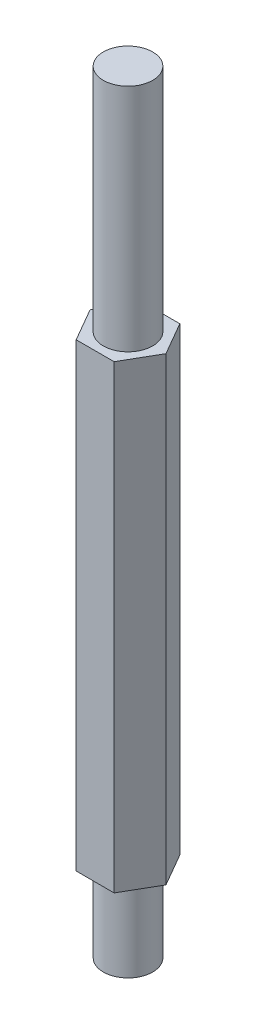
ISO-10303-21;
HEADER;
FILE_DESCRIPTION(('STEP AP214'),'2;1');
FILE_NAME('part.step','',(''),(''),'','','');
FILE_SCHEMA(('AUTOMOTIVE_DESIGN { 1 0 10303 214 1 1 1 1 }'));
ENDSEC;
DATA;
#1=APPLICATION_CONTEXT('core data for automotive mechanical design processes');
#2=APPLICATION_PROTOCOL_DEFINITION('international standard','automotive_design',2000,#1);
#3=PRODUCT_CONTEXT('',#1,'mechanical');
#4=PRODUCT('Part','Part','',(#3));
#5=PRODUCT_RELATED_PRODUCT_CATEGORY('part','',(#4));
#6=PRODUCT_DEFINITION_FORMATION('','',#4);
#7=PRODUCT_DEFINITION_CONTEXT('part definition',#1,'design');
#8=PRODUCT_DEFINITION('design','',#6,#7);
#9=PRODUCT_DEFINITION_SHAPE('','',#8);
#10=(LENGTH_UNIT() NAMED_UNIT(*) SI_UNIT(.MILLI.,.METRE.));
#11=(NAMED_UNIT(*) PLANE_ANGLE_UNIT() SI_UNIT($,.RADIAN.));
#12=(NAMED_UNIT(*) SI_UNIT($,.STERADIAN.) SOLID_ANGLE_UNIT());
#13=UNCERTAINTY_MEASURE_WITH_UNIT(LENGTH_MEASURE(1.E-05),#10,'distance_accuracy_value','');
#14=(GEOMETRIC_REPRESENTATION_CONTEXT(3) GLOBAL_UNCERTAINTY_ASSIGNED_CONTEXT((#13)) GLOBAL_UNIT_ASSIGNED_CONTEXT((#10,
#11,#12)) REPRESENTATION_CONTEXT('',''));
#15=CARTESIAN_POINT('',(0.,0.,0.));
#16=DIRECTION('',(0.,0.,1.));
#17=DIRECTION('',(1.,0.,0.));
#18=AXIS2_PLACEMENT_3D('',#15,#16,#17);
#19=CARTESIAN_POINT('',(-13.929382152786,28.,-4.46581124048437));
#20=DIRECTION('',(-0.866025403784439,0.,-0.5));
#21=DIRECTION('',(-0.5,0.,0.866025403784439));
#22=AXIS2_PLACEMENT_3D('',#19,#20,#21);
#23=PLANE('',#22);
#24=DIRECTION('',(0.5,0.,-0.866025403784439));
#25=VECTOR('',#24,1.);
#26=CARTESIAN_POINT('',(-13.929382152786,0.,-4.46581124048437));
#27=LINE('',#26,#25);
#28=CARTESIAN_POINT('',(-13.929382152786,0.,-4.46581124048437));
#29=VERTEX_POINT('',#28);
#30=CARTESIAN_POINT('',(-12.7746816144068,0.,-6.46581124048437));
#31=VERTEX_POINT('',#30);
#32=EDGE_CURVE('E131',#29,#31,#27,.T.);
#33=ORIENTED_EDGE('',*,*,#32,.T.);
#34=DIRECTION('',(0.,-1.,0.));
#35=VECTOR('',#34,1.);
#36=CARTESIAN_POINT('',(-12.7746816144068,28.,-6.46581124048437));
#37=LINE('',#36,#35);
#38=CARTESIAN_POINT('',(-12.7746816144068,28.,-6.46581124048437));
#39=VERTEX_POINT('',#38);
#40=EDGE_CURVE('E42',#39,#31,#37,.T.);
#41=ORIENTED_EDGE('',*,*,#40,.F.);
#42=DIRECTION('',(0.5,0.,-0.866025403784439));
#43=VECTOR('',#42,1.);
#44=CARTESIAN_POINT('',(-13.929382152786,28.,-4.46581124048437));
#45=LINE('',#44,#43);
#46=CARTESIAN_POINT('',(-13.929382152786,28.,-4.46581124048437));
#47=VERTEX_POINT('',#46);
#48=EDGE_CURVE('E148',#47,#39,#45,.T.);
#49=ORIENTED_EDGE('',*,*,#48,.F.);
#50=DIRECTION('',(0.,-1.,0.));
#51=VECTOR('',#50,1.);
#52=CARTESIAN_POINT('',(-13.929382152786,28.,-4.46581124048437));
#53=LINE('',#52,#51);
#54=EDGE_CURVE('E127',#47,#29,#53,.T.);
#55=ORIENTED_EDGE('',*,*,#54,.T.);
#56=EDGE_LOOP('',(#33,#41,#49,#55));
#57=FACE_BOUND('',#56,.T.);
#58=ADVANCED_FACE('F39',(#57),#23,.F.);
#59=CARTESIAN_POINT('',(-12.7746816144068,28.,-6.46581124048437));
#60=DIRECTION('',(-0.866025403784439,0.,0.5));
#61=DIRECTION('',(0.5,0.,0.866025403784439));
#62=AXIS2_PLACEMENT_3D('',#59,#60,#61);
#63=PLANE('',#62);
#64=DIRECTION('',(-0.5,0.,-0.866025403784439));
#65=VECTOR('',#64,1.);
#66=CARTESIAN_POINT('',(-12.7746816144068,0.,-6.46581124048437));
#67=LINE('',#66,#65);
#68=CARTESIAN_POINT('',(-13.9293821527861,0.,-8.46581124048438));
#69=VERTEX_POINT('',#68);
#70=EDGE_CURVE('E135',#31,#69,#67,.T.);
#71=ORIENTED_EDGE('',*,*,#70,.T.);
#72=DIRECTION('',(0.,-1.,0.));
#73=VECTOR('',#72,1.);
#74=CARTESIAN_POINT('',(-13.9293821527861,28.,-8.46581124048438));
#75=LINE('',#74,#73);
#76=CARTESIAN_POINT('',(-13.9293821527861,28.,-8.46581124048438));
#77=VERTEX_POINT('',#76);
#78=EDGE_CURVE('E154',#77,#69,#75,.T.);
#79=ORIENTED_EDGE('',*,*,#78,.F.);
#80=DIRECTION('',(-0.5,0.,-0.866025403784439));
#81=VECTOR('',#80,1.);
#82=CARTESIAN_POINT('',(-12.7746816144068,28.,-6.46581124048437));
#83=LINE('',#82,#81);
#84=EDGE_CURVE('E96',#39,#77,#83,.T.);
#85=ORIENTED_EDGE('',*,*,#84,.F.);
#86=ORIENTED_EDGE('',*,*,#40,.T.);
#87=EDGE_LOOP('',(#71,#79,#85,#86));
#88=FACE_BOUND('',#87,.T.);
#89=ADVANCED_FACE('F208',(#88),#63,.F.);
#90=CARTESIAN_POINT('',(-13.9293821527861,28.,-8.46581124048438));
#91=DIRECTION('',(0.,0.,1.));
#92=DIRECTION('',(1.,0.,0.));
#93=AXIS2_PLACEMENT_3D('',#90,#91,#92);
#94=PLANE('',#93);
#95=DIRECTION('',(-1.,0.,0.));
#96=VECTOR('',#95,1.);
#97=CARTESIAN_POINT('',(-13.9293821527861,0.,-8.46581124048438));
#98=LINE('',#97,#96);
#99=CARTESIAN_POINT('',(-16.2387832295446,0.,-8.46581124048438));
#100=VERTEX_POINT('',#99);
#101=EDGE_CURVE('E139',#69,#100,#98,.T.);
#102=ORIENTED_EDGE('',*,*,#101,.T.);
#103=DIRECTION('',(0.,-1.,0.));
#104=VECTOR('',#103,1.);
#105=CARTESIAN_POINT('',(-16.2387832295446,28.,-8.46581124048438));
#106=LINE('',#105,#104);
#107=CARTESIAN_POINT('',(-16.2387832295446,28.,-8.46581124048438));
#108=VERTEX_POINT('',#107);
#109=EDGE_CURVE('E120',#108,#100,#106,.T.);
#110=ORIENTED_EDGE('',*,*,#109,.F.);
#111=DIRECTION('',(-1.,0.,0.));
#112=VECTOR('',#111,1.);
#113=CARTESIAN_POINT('',(-13.9293821527861,28.,-8.46581124048438));
#114=LINE('',#113,#112);
#115=EDGE_CURVE('E109',#77,#108,#114,.T.);
#116=ORIENTED_EDGE('',*,*,#115,.F.);
#117=ORIENTED_EDGE('',*,*,#78,.T.);
#118=EDGE_LOOP('',(#102,#110,#116,#117));
#119=FACE_BOUND('',#118,.T.);
#120=ADVANCED_FACE('F212',(#119),#94,.F.);
#121=CARTESIAN_POINT('',(-16.2387832295446,28.,-8.46581124048438));
#122=DIRECTION('',(0.866025403784439,0.,0.499999999999999));
#123=DIRECTION('',(0.499999999999999,0.,-0.866025403784439));
#124=AXIS2_PLACEMENT_3D('',#121,#122,#123);
#125=PLANE('',#124);
#126=DIRECTION('',(-0.499999999999999,0.,0.866025403784439));
#127=VECTOR('',#126,1.);
#128=CARTESIAN_POINT('',(-16.2387832295446,0.,-8.46581124048438));
#129=LINE('',#128,#127);
#130=CARTESIAN_POINT('',(-17.3934837679238,0.,-6.46581124048437));
#131=VERTEX_POINT('',#130);
#132=EDGE_CURVE('E118',#100,#131,#129,.T.);
#133=ORIENTED_EDGE('',*,*,#132,.T.);
#134=DIRECTION('',(0.,-1.,0.));
#135=VECTOR('',#134,1.);
#136=CARTESIAN_POINT('',(-17.3934837679238,28.,-6.46581124048437));
#137=LINE('',#136,#135);
#138=CARTESIAN_POINT('',(-17.3934837679238,28.,-6.46581124048437));
#139=VERTEX_POINT('',#138);
#140=EDGE_CURVE('E115',#139,#131,#137,.T.);
#141=ORIENTED_EDGE('',*,*,#140,.F.);
#142=DIRECTION('',(-0.499999999999999,0.,0.866025403784439));
#143=VECTOR('',#142,1.);
#144=CARTESIAN_POINT('',(-16.2387832295446,28.,-8.46581124048438));
#145=LINE('',#144,#143);
#146=EDGE_CURVE('E103',#108,#139,#145,.T.);
#147=ORIENTED_EDGE('',*,*,#146,.F.);
#148=ORIENTED_EDGE('',*,*,#109,.T.);
#149=EDGE_LOOP('',(#133,#141,#147,#148));
#150=FACE_BOUND('',#149,.T.);
#151=ADVANCED_FACE('F116',(#150),#125,.F.);
#152=CARTESIAN_POINT('',(-17.3934837679238,28.,-6.46581124048437));
#153=DIRECTION('',(0.866025403784439,0.,-0.5));
#154=DIRECTION('',(-0.5,0.,-0.866025403784439));
#155=AXIS2_PLACEMENT_3D('',#152,#153,#154);
#156=PLANE('',#155);
#157=DIRECTION('',(0.5,0.,0.866025403784439));
#158=VECTOR('',#157,1.);
#159=CARTESIAN_POINT('',(-17.3934837679238,0.,-6.46581124048437));
#160=LINE('',#159,#158);
#161=CARTESIAN_POINT('',(-16.2387832295445,0.,-4.46581124048437));
#162=VERTEX_POINT('',#161);
#163=EDGE_CURVE('E81',#131,#162,#160,.T.);
#164=ORIENTED_EDGE('',*,*,#163,.T.);
#165=DIRECTION('',(0.,-1.,0.));
#166=VECTOR('',#165,1.);
#167=CARTESIAN_POINT('',(-16.2387832295445,28.,-4.46581124048437));
#168=LINE('',#167,#166);
#169=CARTESIAN_POINT('',(-16.2387832295445,28.,-4.46581124048437));
#170=VERTEX_POINT('',#169);
#171=EDGE_CURVE('E121',#170,#162,#168,.T.);
#172=ORIENTED_EDGE('',*,*,#171,.F.);
#173=DIRECTION('',(0.5,0.,0.866025403784439));
#174=VECTOR('',#173,1.);
#175=CARTESIAN_POINT('',(-17.3934837679238,28.,-6.46581124048437));
#176=LINE('',#175,#174);
#177=EDGE_CURVE('E107',#139,#170,#176,.T.);
#178=ORIENTED_EDGE('',*,*,#177,.F.);
#179=ORIENTED_EDGE('',*,*,#140,.T.);
#180=EDGE_LOOP('',(#164,#172,#178,#179));
#181=FACE_BOUND('',#180,.T.);
#182=ADVANCED_FACE('F123',(#181),#156,.F.);
#183=CARTESIAN_POINT('',(-16.2387832295445,28.,-4.46581124048437));
#184=DIRECTION('',(0.,0.,-1.));
#185=DIRECTION('',(-1.,0.,0.));
#186=AXIS2_PLACEMENT_3D('',#183,#184,#185);
#187=PLANE('',#186);
#188=DIRECTION('',(1.,0.,0.));
#189=VECTOR('',#188,1.);
#190=CARTESIAN_POINT('',(-16.2387832295445,0.,-4.46581124048437));
#191=LINE('',#190,#189);
#192=EDGE_CURVE('E87',#162,#29,#191,.T.);
#193=ORIENTED_EDGE('',*,*,#192,.T.);
#194=ORIENTED_EDGE('',*,*,#54,.F.);
#195=DIRECTION('',(1.,0.,0.));
#196=VECTOR('',#195,1.);
#197=CARTESIAN_POINT('',(-16.2387832295445,28.,-4.46581124048437));
#198=LINE('',#197,#196);
#199=EDGE_CURVE('E58',#170,#47,#198,.T.);
#200=ORIENTED_EDGE('',*,*,#199,.F.);
#201=ORIENTED_EDGE('',*,*,#171,.T.);
#202=EDGE_LOOP('',(#193,#194,#200,#201));
#203=FACE_BOUND('',#202,.T.);
#204=ADVANCED_FACE('F197',(#203),#187,.F.);
#205=CARTESIAN_POINT('',(0.,28.,0.));
#206=DIRECTION('',(0.,1.,0.));
#207=DIRECTION('',(0.,0.,1.));
#208=AXIS2_PLACEMENT_3D('',#205,#206,#207);
#209=PLANE('',#208);
#210=CARTESIAN_POINT('',(-15.0834837679238,28.,-6.46581124048438));
#211=DIRECTION('',(0.,1.,0.));
#212=DIRECTION('',(0.,0.,1.));
#213=AXIS2_PLACEMENT_3D('',#210,#211,#212);
#214=CIRCLE('',#213,1.5);
#215=CARTESIAN_POINT('',(-15.0834837679238,28.,-4.96581124048438));
#216=VERTEX_POINT('',#215);
#217=EDGE_CURVE('E49',#216,#216,#214,.T.);
#218=ORIENTED_EDGE('',*,*,#217,.F.);
#219=EDGE_LOOP('',(#218));
#220=FACE_BOUND('',#219,.T.);
#221=ORIENTED_EDGE('',*,*,#48,.T.);
#222=ORIENTED_EDGE('',*,*,#84,.T.);
#223=ORIENTED_EDGE('',*,*,#115,.T.);
#224=ORIENTED_EDGE('',*,*,#146,.T.);
#225=ORIENTED_EDGE('',*,*,#177,.T.);
#226=ORIENTED_EDGE('',*,*,#199,.T.);
#227=EDGE_LOOP('',(#221,#222,#223,#224,#225,#226));
#228=FACE_BOUND('',#227,.T.);
#229=ADVANCED_FACE('F105',(#220,#228),#209,.T.);
#230=CARTESIAN_POINT('',(0.,0.,0.));
#231=DIRECTION('',(0.,1.,0.));
#232=DIRECTION('',(0.,0.,1.));
#233=AXIS2_PLACEMENT_3D('',#230,#231,#232);
#234=PLANE('',#233);
#235=CARTESIAN_POINT('',(-15.0834837679238,0.,-6.46581124048438));
#236=DIRECTION('',(0.,-1.,0.));
#237=DIRECTION('',(0.,0.,-1.));
#238=AXIS2_PLACEMENT_3D('',#235,#236,#237);
#239=CIRCLE('',#238,1.5);
#240=CARTESIAN_POINT('',(-15.0834837679238,0.,-7.96581124048438));
#241=VERTEX_POINT('',#240);
#242=EDGE_CURVE('E11',#241,#241,#239,.T.);
#243=ORIENTED_EDGE('',*,*,#242,.F.);
#244=EDGE_LOOP('',(#243));
#245=FACE_BOUND('',#244,.T.);
#246=ORIENTED_EDGE('',*,*,#32,.F.);
#247=ORIENTED_EDGE('',*,*,#192,.F.);
#248=ORIENTED_EDGE('',*,*,#163,.F.);
#249=ORIENTED_EDGE('',*,*,#132,.F.);
#250=ORIENTED_EDGE('',*,*,#101,.F.);
#251=ORIENTED_EDGE('',*,*,#70,.F.);
#252=EDGE_LOOP('',(#246,#247,#248,#249,#250,#251));
#253=FACE_BOUND('',#252,.T.);
#254=ADVANCED_FACE('F189',(#245,#253),#234,.F.);
#255=CARTESIAN_POINT('',(-15.0834837679238,42.,-6.46581124048438));
#256=DIRECTION('',(0.,-1.,0.));
#257=DIRECTION('',(0.,0.,-1.));
#258=AXIS2_PLACEMENT_3D('',#255,#256,#257);
#259=CYLINDRICAL_SURFACE('',#258,1.5);
#260=CARTESIAN_POINT('',(-15.0834837679238,42.,-6.46581124048438));
#261=DIRECTION('',(0.,1.,0.));
#262=DIRECTION('',(0.,0.,1.));
#263=AXIS2_PLACEMENT_3D('',#260,#261,#262);
#264=CIRCLE('',#263,1.5);
#265=CARTESIAN_POINT('',(-15.0834837679238,42.,-4.96581124048438));
#266=VERTEX_POINT('',#265);
#267=EDGE_CURVE('E136',#266,#266,#264,.T.);
#268=ORIENTED_EDGE('',*,*,#267,.F.);
#269=EDGE_LOOP('',(#268));
#270=FACE_BOUND('',#269,.T.);
#271=ORIENTED_EDGE('',*,*,#217,.T.);
#272=EDGE_LOOP('',(#271));
#273=FACE_BOUND('',#272,.T.);
#274=ADVANCED_FACE('F192',(#270,#273),#259,.T.);
#275=CARTESIAN_POINT('',(-15.0834837679238,42.,-6.46581124048438));
#276=DIRECTION('',(0.,1.,0.));
#277=DIRECTION('',(0.,0.,1.));
#278=AXIS2_PLACEMENT_3D('',#275,#276,#277);
#279=PLANE('',#278);
#280=ORIENTED_EDGE('',*,*,#267,.T.);
#281=EDGE_LOOP('',(#280));
#282=FACE_BOUND('',#281,.T.);
#283=ADVANCED_FACE('F185',(#282),#279,.T.);
#284=CARTESIAN_POINT('',(-15.0834837679238,-5.,-6.46581124048438));
#285=DIRECTION('',(0.,1.,0.));
#286=DIRECTION('',(0.,0.,1.));
#287=AXIS2_PLACEMENT_3D('',#284,#285,#286);
#288=CYLINDRICAL_SURFACE('',#287,1.5);
#289=CARTESIAN_POINT('',(-15.0834837679238,-5.,-6.46581124048438));
#290=DIRECTION('',(0.,-1.,0.));
#291=DIRECTION('',(0.,0.,-1.));
#292=AXIS2_PLACEMENT_3D('',#289,#290,#291);
#293=CIRCLE('',#292,1.5);
#294=CARTESIAN_POINT('',(-15.0834837679238,-5.,-7.96581124048438));
#295=VERTEX_POINT('',#294);
#296=EDGE_CURVE('E175',#295,#295,#293,.T.);
#297=ORIENTED_EDGE('',*,*,#296,.F.);
#298=EDGE_LOOP('',(#297));
#299=FACE_BOUND('',#298,.T.);
#300=ORIENTED_EDGE('',*,*,#242,.T.);
#301=EDGE_LOOP('',(#300));
#302=FACE_BOUND('',#301,.T.);
#303=ADVANCED_FACE('F182',(#299,#302),#288,.T.);
#304=CARTESIAN_POINT('',(-15.0834837679238,-5.,-6.46581124048438));
#305=DIRECTION('',(0.,-1.,0.));
#306=DIRECTION('',(0.,0.,-1.));
#307=AXIS2_PLACEMENT_3D('',#304,#305,#306);
#308=PLANE('',#307);
#309=ORIENTED_EDGE('',*,*,#296,.T.);
#310=EDGE_LOOP('',(#309));
#311=FACE_BOUND('',#310,.T.);
#312=ADVANCED_FACE('F180',(#311),#308,.T.);
#313=CLOSED_SHELL('',(#58,#89,#120,#151,#182,#204,#229,#254,#274,#283,#303,#312));
#314=MANIFOLD_SOLID_BREP('B2',#313);
#315=ADVANCED_BREP_SHAPE_REPRESENTATION('',(#18,#314),#14);
#316=SHAPE_DEFINITION_REPRESENTATION(#9,#315);
ENDSEC;
END-ISO-10303-21;
